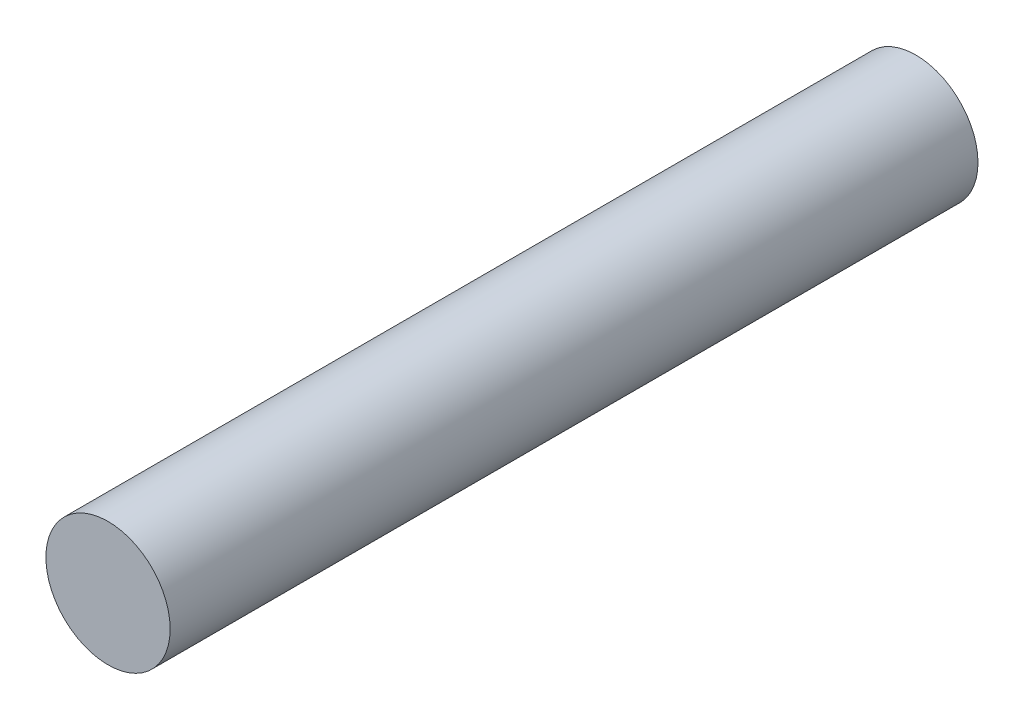
ISO-10303-21;
HEADER;
FILE_DESCRIPTION(('STEP AP214'),'2;1');
FILE_NAME('part.step','',(''),(''),'','','');
FILE_SCHEMA(('AUTOMOTIVE_DESIGN { 1 0 10303 214 1 1 1 1 }'));
ENDSEC;
DATA;
#1=APPLICATION_CONTEXT('core data for automotive mechanical design processes');
#2=APPLICATION_PROTOCOL_DEFINITION('international standard','automotive_design',2000,#1);
#3=PRODUCT_CONTEXT('',#1,'mechanical');
#4=PRODUCT('Part','Part','',(#3));
#5=PRODUCT_RELATED_PRODUCT_CATEGORY('part','',(#4));
#6=PRODUCT_DEFINITION_FORMATION('','',#4);
#7=PRODUCT_DEFINITION_CONTEXT('part definition',#1,'design');
#8=PRODUCT_DEFINITION('design','',#6,#7);
#9=PRODUCT_DEFINITION_SHAPE('','',#8);
#10=(LENGTH_UNIT() NAMED_UNIT(*) SI_UNIT(.MILLI.,.METRE.));
#11=(NAMED_UNIT(*) PLANE_ANGLE_UNIT() SI_UNIT($,.RADIAN.));
#12=(NAMED_UNIT(*) SI_UNIT($,.STERADIAN.) SOLID_ANGLE_UNIT());
#13=UNCERTAINTY_MEASURE_WITH_UNIT(LENGTH_MEASURE(1.E-05),#10,'distance_accuracy_value','');
#14=(GEOMETRIC_REPRESENTATION_CONTEXT(3) GLOBAL_UNCERTAINTY_ASSIGNED_CONTEXT((#13)) GLOBAL_UNIT_ASSIGNED_CONTEXT((#10,
#11,#12)) REPRESENTATION_CONTEXT('',''));
#15=CARTESIAN_POINT('',(0.,0.,0.));
#16=DIRECTION('',(0.,0.,1.));
#17=DIRECTION('',(1.,0.,0.));
#18=AXIS2_PLACEMENT_3D('',#15,#16,#17);
#19=CARTESIAN_POINT('',(0.,0.,33.02));
#20=DIRECTION('',(0.,0.,-1.));
#21=DIRECTION('',(-1.,0.,0.));
#22=AXIS2_PLACEMENT_3D('',#19,#20,#21);
#23=CYLINDRICAL_SURFACE('',#22,2.54);
#24=CARTESIAN_POINT('',(0.,0.,33.02));
#25=DIRECTION('',(0.,0.,1.));
#26=DIRECTION('',(1.,0.,0.));
#27=AXIS2_PLACEMENT_3D('',#24,#25,#26);
#28=CIRCLE('',#27,2.54);
#29=CARTESIAN_POINT('',(2.54,0.,33.02));
#30=VERTEX_POINT('',#29);
#31=EDGE_CURVE('E10',#30,#30,#28,.T.);
#32=ORIENTED_EDGE('',*,*,#31,.F.);
#33=EDGE_LOOP('',(#32));
#34=FACE_BOUND('',#33,.T.);
#35=CARTESIAN_POINT('',(0.,0.,0.));
#36=DIRECTION('',(0.,0.,1.));
#37=DIRECTION('',(1.,0.,0.));
#38=AXIS2_PLACEMENT_3D('',#35,#36,#37);
#39=CIRCLE('',#38,2.54);
#40=CARTESIAN_POINT('',(2.54,0.,0.));
#41=VERTEX_POINT('',#40);
#42=EDGE_CURVE('E40',#41,#41,#39,.T.);
#43=ORIENTED_EDGE('',*,*,#42,.T.);
#44=EDGE_LOOP('',(#43));
#45=FACE_BOUND('',#44,.T.);
#46=ADVANCED_FACE('F37',(#34,#45),#23,.T.);
#47=CARTESIAN_POINT('',(0.,0.,33.02));
#48=DIRECTION('',(0.,0.,1.));
#49=DIRECTION('',(1.,0.,0.));
#50=AXIS2_PLACEMENT_3D('',#47,#48,#49);
#51=PLANE('',#50);
#52=ORIENTED_EDGE('',*,*,#31,.T.);
#53=EDGE_LOOP('',(#52));
#54=FACE_BOUND('',#53,.T.);
#55=ADVANCED_FACE('F54',(#54),#51,.T.);
#56=CARTESIAN_POINT('',(0.,0.,0.));
#57=DIRECTION('',(0.,0.,1.));
#58=DIRECTION('',(1.,0.,0.));
#59=AXIS2_PLACEMENT_3D('',#56,#57,#58);
#60=PLANE('',#59);
#61=ORIENTED_EDGE('',*,*,#42,.F.);
#62=EDGE_LOOP('',(#61));
#63=FACE_BOUND('',#62,.T.);
#64=ADVANCED_FACE('F52',(#63),#60,.F.);
#65=CLOSED_SHELL('',(#46,#55,#64));
#66=MANIFOLD_SOLID_BREP('B2',#65);
#67=ADVANCED_BREP_SHAPE_REPRESENTATION('',(#18,#66),#14);
#68=SHAPE_DEFINITION_REPRESENTATION(#9,#67);
ENDSEC;
END-ISO-10303-21;
